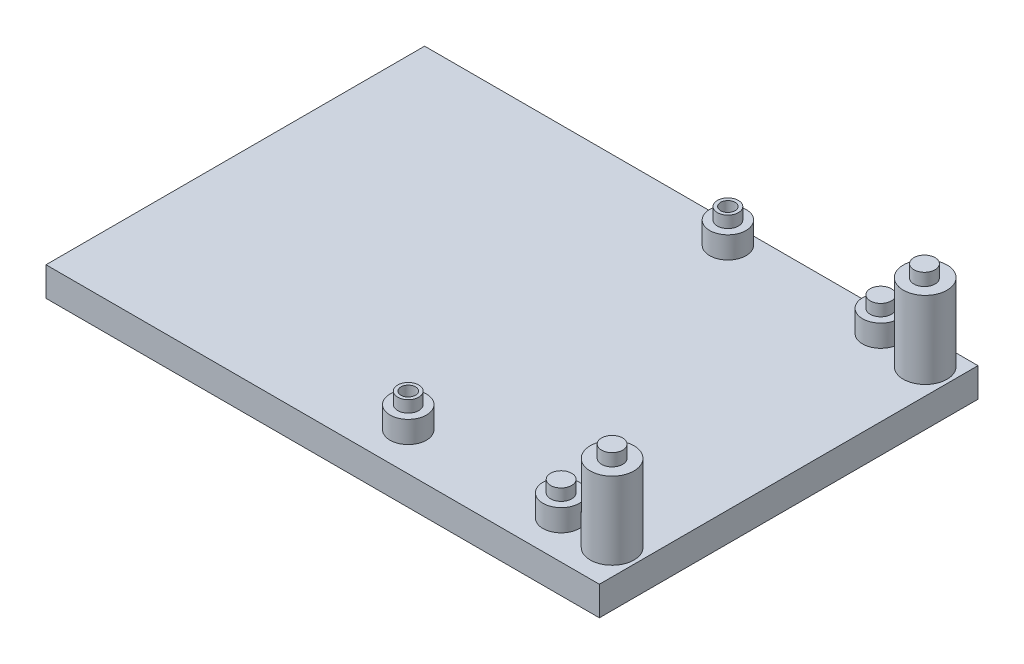
ISO-10303-21;
HEADER;
FILE_DESCRIPTION(('STEP AP214'),'2;1');
FILE_NAME('part.step','',(''),(''),'','','');
FILE_SCHEMA(('AUTOMOTIVE_DESIGN { 1 0 10303 214 1 1 1 1 }'));
ENDSEC;
DATA;
#1=APPLICATION_CONTEXT('core data for automotive mechanical design processes');
#2=APPLICATION_PROTOCOL_DEFINITION('international standard','automotive_design',2000,#1);
#3=PRODUCT_CONTEXT('',#1,'mechanical');
#4=PRODUCT('Part','Part','',(#3));
#5=PRODUCT_RELATED_PRODUCT_CATEGORY('part','',(#4));
#6=PRODUCT_DEFINITION_FORMATION('','',#4);
#7=PRODUCT_DEFINITION_CONTEXT('part definition',#1,'design');
#8=PRODUCT_DEFINITION('design','',#6,#7);
#9=PRODUCT_DEFINITION_SHAPE('','',#8);
#10=(LENGTH_UNIT() NAMED_UNIT(*) SI_UNIT(.MILLI.,.METRE.));
#11=(NAMED_UNIT(*) PLANE_ANGLE_UNIT() SI_UNIT($,.RADIAN.));
#12=(NAMED_UNIT(*) SI_UNIT($,.STERADIAN.) SOLID_ANGLE_UNIT());
#13=UNCERTAINTY_MEASURE_WITH_UNIT(LENGTH_MEASURE(1.E-05),#10,'distance_accuracy_value','');
#14=(GEOMETRIC_REPRESENTATION_CONTEXT(3) GLOBAL_UNCERTAINTY_ASSIGNED_CONTEXT((#13)) GLOBAL_UNIT_ASSIGNED_CONTEXT((#10,
#11,#12)) REPRESENTATION_CONTEXT('',''));
#15=CARTESIAN_POINT('',(0.,0.,0.));
#16=DIRECTION('',(0.,0.,1.));
#17=DIRECTION('',(1.,0.,0.));
#18=AXIS2_PLACEMENT_3D('',#15,#16,#17);
#19=CARTESIAN_POINT('',(42.5,7.,-47.15));
#20=DIRECTION('',(0.,1.,0.));
#21=DIRECTION('',(0.,0.,1.));
#22=AXIS2_PLACEMENT_3D('',#19,#20,#21);
#23=PLANE('',#22);
#24=CARTESIAN_POINT('',(42.5,7.,-47.15));
#25=DIRECTION('',(0.,1.,0.));
#26=DIRECTION('',(0.,0.,1.));
#27=AXIS2_PLACEMENT_3D('',#24,#25,#26);
#28=CIRCLE('',#27,2.5);
#29=CARTESIAN_POINT('',(42.5,7.,-44.65));
#30=VERTEX_POINT('',#29);
#31=EDGE_CURVE('E254',#30,#30,#28,.T.);
#32=ORIENTED_EDGE('',*,*,#31,.T.);
#33=EDGE_LOOP('',(#32));
#34=FACE_BOUND('',#33,.T.);
#35=CARTESIAN_POINT('',(42.5,7.,-47.15));
#36=DIRECTION('',(0.,1.,0.));
#37=DIRECTION('',(0.,0.,1.));
#38=AXIS2_PLACEMENT_3D('',#35,#36,#37);
#39=CIRCLE('',#38,1.45);
#40=CARTESIAN_POINT('',(42.5,7.,-45.7));
#41=VERTEX_POINT('',#40);
#42=EDGE_CURVE('E590',#41,#41,#39,.T.);
#43=ORIENTED_EDGE('',*,*,#42,.F.);
#44=EDGE_LOOP('',(#43));
#45=FACE_BOUND('',#44,.T.);
#46=ADVANCED_FACE('F42',(#34,#45),#23,.T.);
#47=CARTESIAN_POINT('',(42.5,7.,-3.25000000000001));
#48=DIRECTION('',(0.,1.,0.));
#49=DIRECTION('',(0.,0.,1.));
#50=AXIS2_PLACEMENT_3D('',#47,#48,#49);
#51=PLANE('',#50);
#52=CARTESIAN_POINT('',(42.5,7.,-3.25000000000001));
#53=DIRECTION('',(0.,1.,0.));
#54=DIRECTION('',(0.,0.,1.));
#55=AXIS2_PLACEMENT_3D('',#52,#53,#54);
#56=CIRCLE('',#55,2.5);
#57=CARTESIAN_POINT('',(42.5,7.,-0.750000000000005));
#58=VERTEX_POINT('',#57);
#59=EDGE_CURVE('E144',#58,#58,#56,.T.);
#60=ORIENTED_EDGE('',*,*,#59,.T.);
#61=EDGE_LOOP('',(#60));
#62=FACE_BOUND('',#61,.T.);
#63=CARTESIAN_POINT('',(42.5,7.,-3.25000000000001));
#64=DIRECTION('',(0.,1.,0.));
#65=DIRECTION('',(0.,0.,1.));
#66=AXIS2_PLACEMENT_3D('',#63,#64,#65);
#67=CIRCLE('',#66,1.45);
#68=CARTESIAN_POINT('',(42.5,7.,-1.80000000000001));
#69=VERTEX_POINT('',#68);
#70=EDGE_CURVE('E240',#69,#69,#67,.T.);
#71=ORIENTED_EDGE('',*,*,#70,.F.);
#72=EDGE_LOOP('',(#71));
#73=FACE_BOUND('',#72,.T.);
#74=ADVANCED_FACE('F289',(#62,#73),#51,.T.);
#75=CARTESIAN_POINT('',(0.,0.,0.));
#76=DIRECTION('',(0.,-1.,0.));
#77=DIRECTION('',(0.,0.,-1.));
#78=AXIS2_PLACEMENT_3D('',#75,#76,#77);
#79=PLANE('',#78);
#80=DIRECTION('',(0.,0.,-1.));
#81=VECTOR('',#80,1.);
#82=CARTESIAN_POINT('',(74.,0.,1.99999999999999));
#83=LINE('',#82,#81);
#84=CARTESIAN_POINT('',(74.,0.,1.99999999999999));
#85=VERTEX_POINT('',#84);
#86=CARTESIAN_POINT('',(74.,0.,-50.));
#87=VERTEX_POINT('',#86);
#88=EDGE_CURVE('E195',#85,#87,#83,.T.);
#89=ORIENTED_EDGE('',*,*,#88,.F.);
#90=DIRECTION('',(1.,0.,0.));
#91=VECTOR('',#90,1.);
#92=CARTESIAN_POINT('',(-2.00000000000001,0.,1.99999999999999));
#93=LINE('',#92,#91);
#94=CARTESIAN_POINT('',(-2.00000000000001,0.,1.99999999999999));
#95=VERTEX_POINT('',#94);
#96=EDGE_CURVE('E69',#95,#85,#93,.T.);
#97=ORIENTED_EDGE('',*,*,#96,.F.);
#98=DIRECTION('',(0.,0.,1.));
#99=VECTOR('',#98,1.);
#100=CARTESIAN_POINT('',(-2.00000000000001,0.,1.99999999999999));
#101=LINE('',#100,#99);
#102=CARTESIAN_POINT('',(-2.00000000000001,0.,-50.));
#103=VERTEX_POINT('',#102);
#104=EDGE_CURVE('E197',#103,#95,#101,.T.);
#105=ORIENTED_EDGE('',*,*,#104,.F.);
#106=DIRECTION('',(-1.,0.,0.));
#107=VECTOR('',#106,1.);
#108=CARTESIAN_POINT('',(-2.00000000000001,0.,-50.));
#109=LINE('',#108,#107);
#110=EDGE_CURVE('E127',#87,#103,#109,.T.);
#111=ORIENTED_EDGE('',*,*,#110,.F.);
#112=EDGE_LOOP('',(#89,#97,#105,#111));
#113=FACE_BOUND('',#112,.T.);
#114=DIRECTION('',(-1.,0.,0.));
#115=VECTOR('',#114,1.);
#116=CARTESIAN_POINT('',(0.,0.,-44.));
#117=LINE('',#116,#115);
#118=CARTESIAN_POINT('',(72.,0.,-44.));
#119=VERTEX_POINT('',#118);
#120=CARTESIAN_POINT('',(0.,0.,-44.));
#121=VERTEX_POINT('',#120);
#122=EDGE_CURVE('E163',#119,#121,#117,.T.);
#123=ORIENTED_EDGE('',*,*,#122,.T.);
#124=DIRECTION('',(0.,0.,1.));
#125=VECTOR('',#124,1.);
#126=CARTESIAN_POINT('',(0.,0.,0.));
#127=LINE('',#126,#125);
#128=CARTESIAN_POINT('',(0.,0.,0.));
#129=VERTEX_POINT('',#128);
#130=EDGE_CURVE('E61',#121,#129,#127,.T.);
#131=ORIENTED_EDGE('',*,*,#130,.T.);
#132=DIRECTION('',(1.,0.,0.));
#133=VECTOR('',#132,1.);
#134=CARTESIAN_POINT('',(0.,0.,0.));
#135=LINE('',#134,#133);
#136=CARTESIAN_POINT('',(72.,0.,0.));
#137=VERTEX_POINT('',#136);
#138=EDGE_CURVE('E177',#129,#137,#135,.T.);
#139=ORIENTED_EDGE('',*,*,#138,.T.);
#140=DIRECTION('',(0.,0.,-1.));
#141=VECTOR('',#140,1.);
#142=CARTESIAN_POINT('',(72.,0.,0.));
#143=LINE('',#142,#141);
#144=EDGE_CURVE('E181',#137,#119,#143,.T.);
#145=ORIENTED_EDGE('',*,*,#144,.T.);
#146=EDGE_LOOP('',(#123,#131,#139,#145));
#147=FACE_BOUND('',#146,.T.);
#148=ADVANCED_FACE('F295',(#113,#147),#79,.T.);
#149=CARTESIAN_POINT('',(74.,2.,1.99999999999999));
#150=DIRECTION('',(-1.,0.,0.));
#151=DIRECTION('',(0.,0.,1.));
#152=AXIS2_PLACEMENT_3D('',#149,#150,#151);
#153=PLANE('',#152);
#154=ORIENTED_EDGE('',*,*,#88,.T.);
#155=DIRECTION('',(0.,-1.,0.));
#156=VECTOR('',#155,1.);
#157=CARTESIAN_POINT('',(74.,0.,-50.));
#158=LINE('',#157,#156);
#159=CARTESIAN_POINT('',(74.,4.,-50.));
#160=VERTEX_POINT('',#159);
#161=EDGE_CURVE('E138',#160,#87,#158,.T.);
#162=ORIENTED_EDGE('',*,*,#161,.F.);
#163=DIRECTION('',(0.,0.,-1.));
#164=VECTOR('',#163,1.);
#165=CARTESIAN_POINT('',(74.,4.,1.99999999999999));
#166=LINE('',#165,#164);
#167=CARTESIAN_POINT('',(74.,4.,1.99999999999999));
#168=VERTEX_POINT('',#167);
#169=EDGE_CURVE('E133',#168,#160,#166,.T.);
#170=ORIENTED_EDGE('',*,*,#169,.F.);
#171=DIRECTION('',(0.,-1.,0.));
#172=VECTOR('',#171,1.);
#173=CARTESIAN_POINT('',(74.,2.,1.99999999999999));
#174=LINE('',#173,#172);
#175=EDGE_CURVE('E201',#168,#85,#174,.T.);
#176=ORIENTED_EDGE('',*,*,#175,.T.);
#177=EDGE_LOOP('',(#154,#162,#170,#176));
#178=FACE_BOUND('',#177,.T.);
#179=ADVANCED_FACE('F44',(#178),#153,.F.);
#180=CARTESIAN_POINT('',(-2.00000000000001,2.,1.99999999999999));
#181=DIRECTION('',(1.,0.,0.));
#182=DIRECTION('',(0.,0.,-1.));
#183=AXIS2_PLACEMENT_3D('',#180,#181,#182);
#184=PLANE('',#183);
#185=ORIENTED_EDGE('',*,*,#104,.T.);
#186=DIRECTION('',(0.,-1.,0.));
#187=VECTOR('',#186,1.);
#188=CARTESIAN_POINT('',(-2.00000000000001,2.,1.99999999999999));
#189=LINE('',#188,#187);
#190=CARTESIAN_POINT('',(-2.00000000000001,4.,1.99999999999999));
#191=VERTEX_POINT('',#190);
#192=EDGE_CURVE('E121',#191,#95,#189,.T.);
#193=ORIENTED_EDGE('',*,*,#192,.F.);
#194=DIRECTION('',(0.,0.,1.));
#195=VECTOR('',#194,1.);
#196=CARTESIAN_POINT('',(-2.00000000000001,4.,1.99999999999999));
#197=LINE('',#196,#195);
#198=CARTESIAN_POINT('',(-2.00000000000001,4.,-50.));
#199=VERTEX_POINT('',#198);
#200=EDGE_CURVE('E116',#199,#191,#197,.T.);
#201=ORIENTED_EDGE('',*,*,#200,.F.);
#202=DIRECTION('',(0.,1.,0.));
#203=VECTOR('',#202,1.);
#204=CARTESIAN_POINT('',(-2.00000000000001,0.,-50.));
#205=LINE('',#204,#203);
#206=EDGE_CURVE('E120',#103,#199,#205,.T.);
#207=ORIENTED_EDGE('',*,*,#206,.F.);
#208=EDGE_LOOP('',(#185,#193,#201,#207));
#209=FACE_BOUND('',#208,.T.);
#210=ADVANCED_FACE('F118',(#209),#184,.F.);
#211=CARTESIAN_POINT('',(-2.00000000000001,2.,1.99999999999999));
#212=DIRECTION('',(0.,0.,-1.));
#213=DIRECTION('',(-1.,0.,0.));
#214=AXIS2_PLACEMENT_3D('',#211,#212,#213);
#215=PLANE('',#214);
#216=ORIENTED_EDGE('',*,*,#96,.T.);
#217=ORIENTED_EDGE('',*,*,#175,.F.);
#218=DIRECTION('',(1.,0.,0.));
#219=VECTOR('',#218,1.);
#220=CARTESIAN_POINT('',(-2.00000000000001,4.,1.99999999999999));
#221=LINE('',#220,#219);
#222=EDGE_CURVE('E126',#191,#168,#221,.T.);
#223=ORIENTED_EDGE('',*,*,#222,.F.);
#224=ORIENTED_EDGE('',*,*,#192,.T.);
#225=EDGE_LOOP('',(#216,#217,#223,#224));
#226=FACE_BOUND('',#225,.T.);
#227=ADVANCED_FACE('F344',(#226),#215,.F.);
#228=CARTESIAN_POINT('',(0.,2.,0.));
#229=DIRECTION('',(1.,0.,0.));
#230=DIRECTION('',(0.,0.,-1.));
#231=AXIS2_PLACEMENT_3D('',#228,#229,#230);
#232=PLANE('',#231);
#233=ORIENTED_EDGE('',*,*,#130,.F.);
#234=DIRECTION('',(0.,-1.,0.));
#235=VECTOR('',#234,1.);
#236=CARTESIAN_POINT('',(0.,2.,-44.));
#237=LINE('',#236,#235);
#238=CARTESIAN_POINT('',(0.,2.,-44.));
#239=VERTEX_POINT('',#238);
#240=EDGE_CURVE('E174',#239,#121,#237,.T.);
#241=ORIENTED_EDGE('',*,*,#240,.F.);
#242=DIRECTION('',(0.,0.,1.));
#243=VECTOR('',#242,1.);
#244=CARTESIAN_POINT('',(0.,2.,0.));
#245=LINE('',#244,#243);
#246=CARTESIAN_POINT('',(0.,2.,0.));
#247=VERTEX_POINT('',#246);
#248=EDGE_CURVE('E158',#239,#247,#245,.T.);
#249=ORIENTED_EDGE('',*,*,#248,.T.);
#250=DIRECTION('',(0.,-1.,0.));
#251=VECTOR('',#250,1.);
#252=CARTESIAN_POINT('',(0.,2.,0.));
#253=LINE('',#252,#251);
#254=EDGE_CURVE('E193',#247,#129,#253,.T.);
#255=ORIENTED_EDGE('',*,*,#254,.T.);
#256=EDGE_LOOP('',(#233,#241,#249,#255));
#257=FACE_BOUND('',#256,.T.);
#258=ADVANCED_FACE('F340',(#257),#232,.T.);
#259=CARTESIAN_POINT('',(0.,2.,0.));
#260=DIRECTION('',(0.,0.,-1.));
#261=DIRECTION('',(-1.,0.,0.));
#262=AXIS2_PLACEMENT_3D('',#259,#260,#261);
#263=PLANE('',#262);
#264=ORIENTED_EDGE('',*,*,#138,.F.);
#265=ORIENTED_EDGE('',*,*,#254,.F.);
#266=DIRECTION('',(1.,0.,0.));
#267=VECTOR('',#266,1.);
#268=CARTESIAN_POINT('',(0.,2.,0.));
#269=LINE('',#268,#267);
#270=CARTESIAN_POINT('',(72.,2.,0.));
#271=VERTEX_POINT('',#270);
#272=EDGE_CURVE('E162',#247,#271,#269,.T.);
#273=ORIENTED_EDGE('',*,*,#272,.T.);
#274=DIRECTION('',(0.,-1.,0.));
#275=VECTOR('',#274,1.);
#276=CARTESIAN_POINT('',(72.,2.,0.));
#277=LINE('',#276,#275);
#278=EDGE_CURVE('E191',#271,#137,#277,.T.);
#279=ORIENTED_EDGE('',*,*,#278,.T.);
#280=EDGE_LOOP('',(#264,#265,#273,#279));
#281=FACE_BOUND('',#280,.T.);
#282=ADVANCED_FACE('F336',(#281),#263,.T.);
#283=CARTESIAN_POINT('',(72.,2.,0.));
#284=DIRECTION('',(-1.,0.,0.));
#285=DIRECTION('',(0.,0.,1.));
#286=AXIS2_PLACEMENT_3D('',#283,#284,#285);
#287=PLANE('',#286);
#288=ORIENTED_EDGE('',*,*,#144,.F.);
#289=ORIENTED_EDGE('',*,*,#278,.F.);
#290=DIRECTION('',(0.,0.,-1.));
#291=VECTOR('',#290,1.);
#292=CARTESIAN_POINT('',(72.,2.,0.));
#293=LINE('',#292,#291);
#294=CARTESIAN_POINT('',(72.,2.,-44.));
#295=VERTEX_POINT('',#294);
#296=EDGE_CURVE('E167',#271,#295,#293,.T.);
#297=ORIENTED_EDGE('',*,*,#296,.T.);
#298=DIRECTION('',(0.,-1.,0.));
#299=VECTOR('',#298,1.);
#300=CARTESIAN_POINT('',(72.,2.,-44.));
#301=LINE('',#300,#299);
#302=EDGE_CURVE('E189',#295,#119,#301,.T.);
#303=ORIENTED_EDGE('',*,*,#302,.T.);
#304=EDGE_LOOP('',(#288,#289,#297,#303));
#305=FACE_BOUND('',#304,.T.);
#306=ADVANCED_FACE('F332',(#305),#287,.T.);
#307=CARTESIAN_POINT('',(0.,2.,-44.));
#308=DIRECTION('',(0.,0.,1.));
#309=DIRECTION('',(1.,0.,0.));
#310=AXIS2_PLACEMENT_3D('',#307,#308,#309);
#311=PLANE('',#310);
#312=ORIENTED_EDGE('',*,*,#122,.F.);
#313=ORIENTED_EDGE('',*,*,#302,.F.);
#314=DIRECTION('',(-1.,0.,0.));
#315=VECTOR('',#314,1.);
#316=CARTESIAN_POINT('',(0.,2.,-44.));
#317=LINE('',#316,#315);
#318=EDGE_CURVE('E170',#295,#239,#317,.T.);
#319=ORIENTED_EDGE('',*,*,#318,.T.);
#320=ORIENTED_EDGE('',*,*,#240,.T.);
#321=EDGE_LOOP('',(#312,#313,#319,#320));
#322=FACE_BOUND('',#321,.T.);
#323=ADVANCED_FACE('F328',(#322),#311,.T.);
#324=CARTESIAN_POINT('',(0.,2.,0.));
#325=DIRECTION('',(0.,-1.,0.));
#326=DIRECTION('',(0.,0.,-1.));
#327=AXIS2_PLACEMENT_3D('',#324,#325,#326);
#328=PLANE('',#327);
#329=ORIENTED_EDGE('',*,*,#248,.F.);
#330=ORIENTED_EDGE('',*,*,#318,.F.);
#331=ORIENTED_EDGE('',*,*,#296,.F.);
#332=ORIENTED_EDGE('',*,*,#272,.F.);
#333=EDGE_LOOP('',(#329,#330,#331,#332));
#334=FACE_BOUND('',#333,.T.);
#335=ADVANCED_FACE('F323',(#334),#328,.T.);
#336=CARTESIAN_POINT('',(0.,4.,0.));
#337=DIRECTION('',(0.,-1.,0.));
#338=DIRECTION('',(0.,0.,-1.));
#339=AXIS2_PLACEMENT_3D('',#336,#337,#338);
#340=PLANE('',#339);
#341=CARTESIAN_POINT('',(70.5,4.,-46.25));
#342=DIRECTION('',(0.,-1.,0.));
#343=DIRECTION('',(0.,0.,-1.));
#344=AXIS2_PLACEMENT_3D('',#341,#342,#343);
#345=CIRCLE('',#344,3.00000000000001);
#346=CARTESIAN_POINT('',(70.5,4.,-49.25));
#347=VERTEX_POINT('',#346);
#348=EDGE_CURVE('E46',#347,#347,#345,.F.);
#349=ORIENTED_EDGE('',*,*,#348,.F.);
#350=EDGE_LOOP('',(#349));
#351=FACE_BOUND('',#350,.T.);
#352=CARTESIAN_POINT('',(70.5,4.,-3.25000000000001));
#353=DIRECTION('',(0.,-1.,0.));
#354=DIRECTION('',(0.,0.,-1.));
#355=AXIS2_PLACEMENT_3D('',#352,#353,#354);
#356=CIRCLE('',#355,3.00000000000001);
#357=CARTESIAN_POINT('',(70.5,4.,-6.25000000000002));
#358=VERTEX_POINT('',#357);
#359=EDGE_CURVE('E218',#358,#358,#356,.F.);
#360=ORIENTED_EDGE('',*,*,#359,.F.);
#361=EDGE_LOOP('',(#360));
#362=FACE_BOUND('',#361,.T.);
#363=CARTESIAN_POINT('',(63.5,4.,-47.15));
#364=DIRECTION('',(0.,-1.,0.));
#365=DIRECTION('',(0.,0.,-1.));
#366=AXIS2_PLACEMENT_3D('',#363,#364,#365);
#367=CIRCLE('',#366,2.5);
#368=CARTESIAN_POINT('',(63.5,4.,-49.65));
#369=VERTEX_POINT('',#368);
#370=EDGE_CURVE('E214',#369,#369,#367,.F.);
#371=ORIENTED_EDGE('',*,*,#370,.F.);
#372=EDGE_LOOP('',(#371));
#373=FACE_BOUND('',#372,.T.);
#374=CARTESIAN_POINT('',(42.5,4.,-47.15));
#375=DIRECTION('',(0.,-1.,0.));
#376=DIRECTION('',(0.,0.,-1.));
#377=AXIS2_PLACEMENT_3D('',#374,#375,#376);
#378=CIRCLE('',#377,2.5);
#379=CARTESIAN_POINT('',(42.5,4.,-49.65));
#380=VERTEX_POINT('',#379);
#381=EDGE_CURVE('E210',#380,#380,#378,.F.);
#382=ORIENTED_EDGE('',*,*,#381,.F.);
#383=EDGE_LOOP('',(#382));
#384=FACE_BOUND('',#383,.T.);
#385=CARTESIAN_POINT('',(63.5,4.,-3.25000000000001));
#386=DIRECTION('',(0.,-1.,0.));
#387=DIRECTION('',(0.,0.,-1.));
#388=AXIS2_PLACEMENT_3D('',#385,#386,#387);
#389=CIRCLE('',#388,2.5);
#390=CARTESIAN_POINT('',(63.5,4.,-5.75));
#391=VERTEX_POINT('',#390);
#392=EDGE_CURVE('E207',#391,#391,#389,.F.);
#393=ORIENTED_EDGE('',*,*,#392,.F.);
#394=EDGE_LOOP('',(#393));
#395=FACE_BOUND('',#394,.T.);
#396=CARTESIAN_POINT('',(42.5,4.,-3.25000000000001));
#397=DIRECTION('',(0.,-1.,0.));
#398=DIRECTION('',(0.,0.,-1.));
#399=AXIS2_PLACEMENT_3D('',#396,#397,#398);
#400=CIRCLE('',#399,2.5);
#401=CARTESIAN_POINT('',(42.5,4.,-5.75000000000001));
#402=VERTEX_POINT('',#401);
#403=EDGE_CURVE('E204',#402,#402,#400,.F.);
#404=ORIENTED_EDGE('',*,*,#403,.F.);
#405=EDGE_LOOP('',(#404));
#406=FACE_BOUND('',#405,.T.);
#407=ORIENTED_EDGE('',*,*,#200,.T.);
#408=ORIENTED_EDGE('',*,*,#222,.T.);
#409=ORIENTED_EDGE('',*,*,#169,.T.);
#410=DIRECTION('',(1.,0.,0.));
#411=VECTOR('',#410,1.);
#412=CARTESIAN_POINT('',(-2.00000000000001,4.,-50.));
#413=LINE('',#412,#411);
#414=EDGE_CURVE('E130',#199,#160,#413,.T.);
#415=ORIENTED_EDGE('',*,*,#414,.F.);
#416=EDGE_LOOP('',(#407,#408,#409,#415));
#417=FACE_BOUND('',#416,.T.);
#418=ADVANCED_FACE('F131',(#351,#362,#373,#384,#395,#406,#417),#340,.F.);
#419=CARTESIAN_POINT('',(0.,0.,-50.));
#420=DIRECTION('',(0.,0.,-1.));
#421=DIRECTION('',(-1.,0.,0.));
#422=AXIS2_PLACEMENT_3D('',#419,#420,#421);
#423=PLANE('',#422);
#424=ORIENTED_EDGE('',*,*,#206,.T.);
#425=ORIENTED_EDGE('',*,*,#414,.T.);
#426=ORIENTED_EDGE('',*,*,#161,.T.);
#427=ORIENTED_EDGE('',*,*,#110,.T.);
#428=EDGE_LOOP('',(#424,#425,#426,#427));
#429=FACE_BOUND('',#428,.T.);
#430=ADVANCED_FACE('F141',(#429),#423,.T.);
#431=CARTESIAN_POINT('',(42.5,7.,-3.25000000000001));
#432=DIRECTION('',(0.,-1.,0.));
#433=DIRECTION('',(0.,0.,-1.));
#434=AXIS2_PLACEMENT_3D('',#431,#432,#433);
#435=CYLINDRICAL_SURFACE('',#434,2.5);
#436=ORIENTED_EDGE('',*,*,#59,.F.);
#437=EDGE_LOOP('',(#436));
#438=FACE_BOUND('',#437,.T.);
#439=ORIENTED_EDGE('',*,*,#403,.T.);
#440=EDGE_LOOP('',(#439));
#441=FACE_BOUND('',#440,.T.);
#442=ADVANCED_FACE('F313',(#438,#441),#435,.T.);
#443=CARTESIAN_POINT('',(63.5,7.,-3.25000000000001));
#444=DIRECTION('',(0.,-1.,0.));
#445=DIRECTION('',(0.,0.,-1.));
#446=AXIS2_PLACEMENT_3D('',#443,#444,#445);
#447=CYLINDRICAL_SURFACE('',#446,2.5);
#448=CARTESIAN_POINT('',(63.5,7.,-3.25000000000001));
#449=DIRECTION('',(0.,1.,0.));
#450=DIRECTION('',(0.,0.,1.));
#451=AXIS2_PLACEMENT_3D('',#448,#449,#450);
#452=CIRCLE('',#451,2.5);
#453=CARTESIAN_POINT('',(63.5,7.,-0.750000000000012));
#454=VERTEX_POINT('',#453);
#455=EDGE_CURVE('E258',#454,#454,#452,.T.);
#456=ORIENTED_EDGE('',*,*,#455,.F.);
#457=EDGE_LOOP('',(#456));
#458=FACE_BOUND('',#457,.T.);
#459=ORIENTED_EDGE('',*,*,#392,.T.);
#460=EDGE_LOOP('',(#459));
#461=FACE_BOUND('',#460,.T.);
#462=ADVANCED_FACE('F310',(#458,#461),#447,.T.);
#463=CARTESIAN_POINT('',(63.5,7.,-3.25000000000001));
#464=DIRECTION('',(0.,1.,0.));
#465=DIRECTION('',(0.,0.,1.));
#466=AXIS2_PLACEMENT_3D('',#463,#464,#465);
#467=PLANE('',#466);
#468=CARTESIAN_POINT('',(63.5,7.,-3.25000000000001));
#469=DIRECTION('',(0.,1.,0.));
#470=DIRECTION('',(0.,0.,1.));
#471=AXIS2_PLACEMENT_3D('',#468,#469,#470);
#472=CIRCLE('',#471,1.45);
#473=CARTESIAN_POINT('',(63.5,7.,-1.80000000000001));
#474=VERTEX_POINT('',#473);
#475=EDGE_CURVE('E217',#474,#474,#472,.T.);
#476=ORIENTED_EDGE('',*,*,#475,.F.);
#477=EDGE_LOOP('',(#476));
#478=FACE_BOUND('',#477,.T.);
#479=ORIENTED_EDGE('',*,*,#455,.T.);
#480=EDGE_LOOP('',(#479));
#481=FACE_BOUND('',#480,.T.);
#482=ADVANCED_FACE('F306',(#478,#481),#467,.T.);
#483=CARTESIAN_POINT('',(42.5,7.,-47.15));
#484=DIRECTION('',(0.,-1.,0.));
#485=DIRECTION('',(0.,0.,-1.));
#486=AXIS2_PLACEMENT_3D('',#483,#484,#485);
#487=CYLINDRICAL_SURFACE('',#486,2.5);
#488=ORIENTED_EDGE('',*,*,#31,.F.);
#489=EDGE_LOOP('',(#488));
#490=FACE_BOUND('',#489,.T.);
#491=ORIENTED_EDGE('',*,*,#381,.T.);
#492=EDGE_LOOP('',(#491));
#493=FACE_BOUND('',#492,.T.);
#494=ADVANCED_FACE('F303',(#490,#493),#487,.T.);
#495=CARTESIAN_POINT('',(63.5,7.,-47.15));
#496=DIRECTION('',(0.,-1.,0.));
#497=DIRECTION('',(0.,0.,-1.));
#498=AXIS2_PLACEMENT_3D('',#495,#496,#497);
#499=CYLINDRICAL_SURFACE('',#498,2.5);
#500=CARTESIAN_POINT('',(63.5,7.,-47.15));
#501=DIRECTION('',(0.,1.,0.));
#502=DIRECTION('',(0.,0.,1.));
#503=AXIS2_PLACEMENT_3D('',#500,#501,#502);
#504=CIRCLE('',#503,2.5);
#505=CARTESIAN_POINT('',(63.5,7.,-44.65));
#506=VERTEX_POINT('',#505);
#507=EDGE_CURVE('E244',#506,#506,#504,.T.);
#508=ORIENTED_EDGE('',*,*,#507,.F.);
#509=EDGE_LOOP('',(#508));
#510=FACE_BOUND('',#509,.T.);
#511=ORIENTED_EDGE('',*,*,#370,.T.);
#512=EDGE_LOOP('',(#511));
#513=FACE_BOUND('',#512,.T.);
#514=ADVANCED_FACE('F284',(#510,#513),#499,.T.);
#515=CARTESIAN_POINT('',(63.5,7.,-47.15));
#516=DIRECTION('',(0.,1.,0.));
#517=DIRECTION('',(0.,0.,1.));
#518=AXIS2_PLACEMENT_3D('',#515,#516,#517);
#519=PLANE('',#518);
#520=CARTESIAN_POINT('',(63.5,7.,-47.15));
#521=DIRECTION('',(0.,1.,0.));
#522=DIRECTION('',(0.,0.,1.));
#523=AXIS2_PLACEMENT_3D('',#520,#521,#522);
#524=CIRCLE('',#523,1.45);
#525=CARTESIAN_POINT('',(63.5,7.,-45.7));
#526=VERTEX_POINT('',#525);
#527=EDGE_CURVE('E220',#526,#526,#524,.T.);
#528=ORIENTED_EDGE('',*,*,#527,.F.);
#529=EDGE_LOOP('',(#528));
#530=FACE_BOUND('',#529,.T.);
#531=ORIENTED_EDGE('',*,*,#507,.T.);
#532=EDGE_LOOP('',(#531));
#533=FACE_BOUND('',#532,.T.);
#534=ADVANCED_FACE('F275',(#530,#533),#519,.T.);
#535=CARTESIAN_POINT('',(42.5,8.6,-3.25000000000001));
#536=DIRECTION('',(0.,1.,0.));
#537=DIRECTION('',(0.,0.,1.));
#538=AXIS2_PLACEMENT_3D('',#535,#536,#537);
#539=PLANE('',#538);
#540=CARTESIAN_POINT('',(42.5,8.6,-3.25000000000001));
#541=DIRECTION('',(0.,1.,0.));
#542=DIRECTION('',(0.,0.,1.));
#543=AXIS2_PLACEMENT_3D('',#540,#541,#542);
#544=CIRCLE('',#543,1.45);
#545=CARTESIAN_POINT('',(42.5,8.6,-1.80000000000001));
#546=VERTEX_POINT('',#545);
#547=EDGE_CURVE('E241',#546,#546,#544,.T.);
#548=ORIENTED_EDGE('',*,*,#547,.T.);
#549=EDGE_LOOP('',(#548));
#550=FACE_BOUND('',#549,.T.);
#551=CARTESIAN_POINT('',(42.5,8.6,-3.25000000000001));
#552=DIRECTION('',(0.,1.,0.));
#553=DIRECTION('',(0.,0.,1.));
#554=AXIS2_PLACEMENT_3D('',#551,#552,#553);
#555=CIRCLE('',#554,0.999999999999998);
#556=CARTESIAN_POINT('',(42.5,8.6,-2.25000000000001));
#557=VERTEX_POINT('',#556);
#558=EDGE_CURVE('E236',#557,#557,#555,.T.);
#559=ORIENTED_EDGE('',*,*,#558,.F.);
#560=EDGE_LOOP('',(#559));
#561=FACE_BOUND('',#560,.T.);
#562=ADVANCED_FACE('F272',(#550,#561),#539,.T.);
#563=CARTESIAN_POINT('',(42.5,8.6,-3.25000000000001));
#564=DIRECTION('',(0.,-1.,0.));
#565=DIRECTION('',(0.,0.,-1.));
#566=AXIS2_PLACEMENT_3D('',#563,#564,#565);
#567=CYLINDRICAL_SURFACE('',#566,1.45);
#568=ORIENTED_EDGE('',*,*,#547,.F.);
#569=EDGE_LOOP('',(#568));
#570=FACE_BOUND('',#569,.T.);
#571=ORIENTED_EDGE('',*,*,#70,.T.);
#572=EDGE_LOOP('',(#571));
#573=FACE_BOUND('',#572,.T.);
#574=ADVANCED_FACE('F274',(#570,#573),#567,.T.);
#575=CARTESIAN_POINT('',(42.5,4.,-3.25000000000001));
#576=DIRECTION('',(0.,1.,0.));
#577=DIRECTION('',(0.,0.,1.));
#578=AXIS2_PLACEMENT_3D('',#575,#576,#577);
#579=CIRCLE('',#578,0.999999999999998);
#580=CARTESIAN_POINT('',(42.5,4.,-2.25000000000001));
#581=VERTEX_POINT('',#580);
#582=EDGE_CURVE('E148',#581,#581,#579,.T.);
#583=ORIENTED_EDGE('',*,*,#582,.T.);
#584=EDGE_LOOP('',(#583));
#585=FACE_BOUND('',#584,.T.);
#586=ADVANCED_FACE('F263',(#585),#340,.F.);
#587=CARTESIAN_POINT('',(42.5,7.,-3.25000000000001));
#588=DIRECTION('',(0.,-1.,0.));
#589=DIRECTION('',(0.,0.,-1.));
#590=AXIS2_PLACEMENT_3D('',#587,#588,#589);
#591=CYLINDRICAL_SURFACE('',#590,0.999999999999998);
#592=ORIENTED_EDGE('',*,*,#582,.F.);
#593=EDGE_LOOP('',(#592));
#594=FACE_BOUND('',#593,.T.);
#595=ORIENTED_EDGE('',*,*,#558,.T.);
#596=EDGE_LOOP('',(#595));
#597=FACE_BOUND('',#596,.T.);
#598=ADVANCED_FACE('F265',(#594,#597),#591,.F.);
#599=CARTESIAN_POINT('',(63.5,8.6,-3.25000000000001));
#600=DIRECTION('',(0.,-1.,0.));
#601=DIRECTION('',(0.,0.,-1.));
#602=AXIS2_PLACEMENT_3D('',#599,#600,#601);
#603=CYLINDRICAL_SURFACE('',#602,1.45);
#604=CARTESIAN_POINT('',(63.5,8.6,-3.25000000000001));
#605=DIRECTION('',(0.,1.,0.));
#606=DIRECTION('',(0.,0.,1.));
#607=AXIS2_PLACEMENT_3D('',#604,#605,#606);
#608=CIRCLE('',#607,1.45);
#609=CARTESIAN_POINT('',(63.5,8.6,-1.80000000000001));
#610=VERTEX_POINT('',#609);
#611=EDGE_CURVE('E234',#610,#610,#608,.T.);
#612=ORIENTED_EDGE('',*,*,#611,.F.);
#613=EDGE_LOOP('',(#612));
#614=FACE_BOUND('',#613,.T.);
#615=ORIENTED_EDGE('',*,*,#475,.T.);
#616=EDGE_LOOP('',(#615));
#617=FACE_BOUND('',#616,.T.);
#618=ADVANCED_FACE('F268',(#614,#617),#603,.T.);
#619=CARTESIAN_POINT('',(63.5,8.6,-3.25000000000001));
#620=DIRECTION('',(0.,1.,0.));
#621=DIRECTION('',(0.,0.,1.));
#622=AXIS2_PLACEMENT_3D('',#619,#620,#621);
#623=PLANE('',#622);
#624=ORIENTED_EDGE('',*,*,#611,.T.);
#625=EDGE_LOOP('',(#624));
#626=FACE_BOUND('',#625,.T.);
#627=ADVANCED_FACE('F418',(#626),#623,.T.);
#628=CARTESIAN_POINT('',(63.5,8.6,-47.15));
#629=DIRECTION('',(0.,-1.,0.));
#630=DIRECTION('',(0.,0.,-1.));
#631=AXIS2_PLACEMENT_3D('',#628,#629,#630);
#632=CYLINDRICAL_SURFACE('',#631,1.45);
#633=CARTESIAN_POINT('',(63.5,8.6,-47.15));
#634=DIRECTION('',(0.,1.,0.));
#635=DIRECTION('',(0.,0.,1.));
#636=AXIS2_PLACEMENT_3D('',#633,#634,#635);
#637=CIRCLE('',#636,1.45);
#638=CARTESIAN_POINT('',(63.5,8.6,-45.7));
#639=VERTEX_POINT('',#638);
#640=EDGE_CURVE('E232',#639,#639,#637,.T.);
#641=ORIENTED_EDGE('',*,*,#640,.F.);
#642=EDGE_LOOP('',(#641));
#643=FACE_BOUND('',#642,.T.);
#644=ORIENTED_EDGE('',*,*,#527,.T.);
#645=EDGE_LOOP('',(#644));
#646=FACE_BOUND('',#645,.T.);
#647=ADVANCED_FACE('F427',(#643,#646),#632,.T.);
#648=CARTESIAN_POINT('',(63.5,8.6,-47.15));
#649=DIRECTION('',(0.,1.,0.));
#650=DIRECTION('',(0.,0.,1.));
#651=AXIS2_PLACEMENT_3D('',#648,#649,#650);
#652=PLANE('',#651);
#653=ORIENTED_EDGE('',*,*,#640,.T.);
#654=EDGE_LOOP('',(#653));
#655=FACE_BOUND('',#654,.T.);
#656=ADVANCED_FACE('F437',(#655),#652,.T.);
#657=CARTESIAN_POINT('',(42.5,8.6,-47.15));
#658=DIRECTION('',(0.,1.,0.));
#659=DIRECTION('',(0.,0.,1.));
#660=AXIS2_PLACEMENT_3D('',#657,#658,#659);
#661=PLANE('',#660);
#662=CARTESIAN_POINT('',(42.5,8.6,-47.15));
#663=DIRECTION('',(0.,1.,0.));
#664=DIRECTION('',(0.,0.,1.));
#665=AXIS2_PLACEMENT_3D('',#662,#663,#664);
#666=CIRCLE('',#665,1.45);
#667=CARTESIAN_POINT('',(42.5,8.6,-45.7));
#668=VERTEX_POINT('',#667);
#669=EDGE_CURVE('E591',#668,#668,#666,.T.);
#670=ORIENTED_EDGE('',*,*,#669,.T.);
#671=EDGE_LOOP('',(#670));
#672=FACE_BOUND('',#671,.T.);
#673=CARTESIAN_POINT('',(42.5,8.6,-47.15));
#674=DIRECTION('',(0.,1.,0.));
#675=DIRECTION('',(0.,0.,1.));
#676=AXIS2_PLACEMENT_3D('',#673,#674,#675);
#677=CIRCLE('',#676,0.999999999999998);
#678=CARTESIAN_POINT('',(42.5,8.6,-46.15));
#679=VERTEX_POINT('',#678);
#680=EDGE_CURVE('E586',#679,#679,#677,.T.);
#681=ORIENTED_EDGE('',*,*,#680,.F.);
#682=EDGE_LOOP('',(#681));
#683=FACE_BOUND('',#682,.T.);
#684=ADVANCED_FACE('F447',(#672,#683),#661,.T.);
#685=CARTESIAN_POINT('',(42.5,8.6,-47.15));
#686=DIRECTION('',(0.,-1.,0.));
#687=DIRECTION('',(0.,0.,-1.));
#688=AXIS2_PLACEMENT_3D('',#685,#686,#687);
#689=CYLINDRICAL_SURFACE('',#688,1.45);
#690=ORIENTED_EDGE('',*,*,#669,.F.);
#691=EDGE_LOOP('',(#690));
#692=FACE_BOUND('',#691,.T.);
#693=ORIENTED_EDGE('',*,*,#42,.T.);
#694=EDGE_LOOP('',(#693));
#695=FACE_BOUND('',#694,.T.);
#696=ADVANCED_FACE('F457',(#692,#695),#689,.T.);
#697=CARTESIAN_POINT('',(42.5,4.,-47.15));
#698=DIRECTION('',(0.,1.,0.));
#699=DIRECTION('',(0.,0.,1.));
#700=AXIS2_PLACEMENT_3D('',#697,#698,#699);
#701=CIRCLE('',#700,0.999999999999998);
#702=CARTESIAN_POINT('',(42.5,4.,-46.15));
#703=VERTEX_POINT('',#702);
#704=EDGE_CURVE('E250',#703,#703,#701,.T.);
#705=ORIENTED_EDGE('',*,*,#704,.T.);
#706=EDGE_LOOP('',(#705));
#707=FACE_BOUND('',#706,.T.);
#708=ADVANCED_FACE('F325',(#707),#340,.F.);
#709=CARTESIAN_POINT('',(42.5,7.,-47.15));
#710=DIRECTION('',(0.,-1.,0.));
#711=DIRECTION('',(0.,0.,-1.));
#712=AXIS2_PLACEMENT_3D('',#709,#710,#711);
#713=CYLINDRICAL_SURFACE('',#712,0.999999999999998);
#714=ORIENTED_EDGE('',*,*,#704,.F.);
#715=EDGE_LOOP('',(#714));
#716=FACE_BOUND('',#715,.T.);
#717=ORIENTED_EDGE('',*,*,#680,.T.);
#718=EDGE_LOOP('',(#717));
#719=FACE_BOUND('',#718,.T.);
#720=ADVANCED_FACE('F301',(#716,#719),#713,.F.);
#721=CARTESIAN_POINT('',(70.5,14.6,-3.25000000000001));
#722=DIRECTION('',(0.,-1.,0.));
#723=DIRECTION('',(0.,0.,-1.));
#724=AXIS2_PLACEMENT_3D('',#721,#722,#723);
#725=CYLINDRICAL_SURFACE('',#724,3.00000000000001);
#726=CARTESIAN_POINT('',(70.5,14.6,-3.25000000000001));
#727=DIRECTION('',(0.,1.,0.));
#728=DIRECTION('',(0.,0.,1.));
#729=AXIS2_PLACEMENT_3D('',#726,#727,#728);
#730=CIRCLE('',#729,3.00000000000001);
#731=CARTESIAN_POINT('',(70.5,14.6,-0.249999999999999));
#732=VERTEX_POINT('',#731);
#733=EDGE_CURVE('E583',#732,#732,#730,.T.);
#734=ORIENTED_EDGE('',*,*,#733,.F.);
#735=EDGE_LOOP('',(#734));
#736=FACE_BOUND('',#735,.T.);
#737=ORIENTED_EDGE('',*,*,#359,.T.);
#738=EDGE_LOOP('',(#737));
#739=FACE_BOUND('',#738,.T.);
#740=ADVANCED_FACE('F477',(#736,#739),#725,.T.);
#741=CARTESIAN_POINT('',(70.5,14.6,-3.25000000000001));
#742=DIRECTION('',(0.,1.,0.));
#743=DIRECTION('',(0.,0.,1.));
#744=AXIS2_PLACEMENT_3D('',#741,#742,#743);
#745=PLANE('',#744);
#746=CARTESIAN_POINT('',(70.5,14.6,-3.25000000000001));
#747=DIRECTION('',(0.,1.,0.));
#748=DIRECTION('',(0.,0.,1.));
#749=AXIS2_PLACEMENT_3D('',#746,#747,#748);
#750=CIRCLE('',#749,1.45);
#751=CARTESIAN_POINT('',(70.5,14.6,-1.80000000000001));
#752=VERTEX_POINT('',#751);
#753=EDGE_CURVE('E51',#752,#752,#750,.T.);
#754=ORIENTED_EDGE('',*,*,#753,.F.);
#755=EDGE_LOOP('',(#754));
#756=FACE_BOUND('',#755,.T.);
#757=ORIENTED_EDGE('',*,*,#733,.T.);
#758=EDGE_LOOP('',(#757));
#759=FACE_BOUND('',#758,.T.);
#760=ADVANCED_FACE('F496',(#756,#759),#745,.T.);
#761=CARTESIAN_POINT('',(70.5,14.6,-46.25));
#762=DIRECTION('',(0.,-1.,0.));
#763=DIRECTION('',(0.,0.,-1.));
#764=AXIS2_PLACEMENT_3D('',#761,#762,#763);
#765=CYLINDRICAL_SURFACE('',#764,3.00000000000001);
#766=CARTESIAN_POINT('',(70.5,14.6,-46.25));
#767=DIRECTION('',(0.,1.,0.));
#768=DIRECTION('',(0.,0.,1.));
#769=AXIS2_PLACEMENT_3D('',#766,#767,#768);
#770=CIRCLE('',#769,3.00000000000001);
#771=CARTESIAN_POINT('',(70.5,14.6,-43.25));
#772=VERTEX_POINT('',#771);
#773=EDGE_CURVE('E576',#772,#772,#770,.T.);
#774=ORIENTED_EDGE('',*,*,#773,.F.);
#775=EDGE_LOOP('',(#774));
#776=FACE_BOUND('',#775,.T.);
#777=ORIENTED_EDGE('',*,*,#348,.T.);
#778=EDGE_LOOP('',(#777));
#779=FACE_BOUND('',#778,.T.);
#780=ADVANCED_FACE('F504',(#776,#779),#765,.T.);
#781=CARTESIAN_POINT('',(70.5,14.6,-46.25));
#782=DIRECTION('',(0.,1.,0.));
#783=DIRECTION('',(0.,0.,1.));
#784=AXIS2_PLACEMENT_3D('',#781,#782,#783);
#785=PLANE('',#784);
#786=CARTESIAN_POINT('',(70.5,14.6,-46.15));
#787=DIRECTION('',(0.,1.,0.));
#788=DIRECTION('',(0.,0.,1.));
#789=AXIS2_PLACEMENT_3D('',#786,#787,#788);
#790=CIRCLE('',#789,1.45);
#791=CARTESIAN_POINT('',(70.5,14.6,-44.7));
#792=VERTEX_POINT('',#791);
#793=EDGE_CURVE('E11',#792,#792,#790,.T.);
#794=ORIENTED_EDGE('',*,*,#793,.F.);
#795=EDGE_LOOP('',(#794));
#796=FACE_BOUND('',#795,.T.);
#797=ORIENTED_EDGE('',*,*,#773,.T.);
#798=EDGE_LOOP('',(#797));
#799=FACE_BOUND('',#798,.T.);
#800=ADVANCED_FACE('F509',(#796,#799),#785,.T.);
#801=CARTESIAN_POINT('',(70.5,16.3,-3.25000000000001));
#802=DIRECTION('',(0.,-1.,0.));
#803=DIRECTION('',(0.,0.,-1.));
#804=AXIS2_PLACEMENT_3D('',#801,#802,#803);
#805=CYLINDRICAL_SURFACE('',#804,1.45);
#806=CARTESIAN_POINT('',(70.5,16.3,-3.25000000000001));
#807=DIRECTION('',(0.,1.,0.));
#808=DIRECTION('',(0.,0.,1.));
#809=AXIS2_PLACEMENT_3D('',#806,#807,#808);
#810=CIRCLE('',#809,1.45);
#811=CARTESIAN_POINT('',(70.5,16.3,-1.80000000000001));
#812=VERTEX_POINT('',#811);
#813=EDGE_CURVE('E573',#812,#812,#810,.T.);
#814=ORIENTED_EDGE('',*,*,#813,.F.);
#815=EDGE_LOOP('',(#814));
#816=FACE_BOUND('',#815,.T.);
#817=ORIENTED_EDGE('',*,*,#753,.T.);
#818=EDGE_LOOP('',(#817));
#819=FACE_BOUND('',#818,.T.);
#820=ADVANCED_FACE('F526',(#816,#819),#805,.T.);
#821=CARTESIAN_POINT('',(70.5,16.3,-3.25000000000001));
#822=DIRECTION('',(0.,1.,0.));
#823=DIRECTION('',(0.,0.,1.));
#824=AXIS2_PLACEMENT_3D('',#821,#822,#823);
#825=PLANE('',#824);
#826=ORIENTED_EDGE('',*,*,#813,.T.);
#827=EDGE_LOOP('',(#826));
#828=FACE_BOUND('',#827,.T.);
#829=ADVANCED_FACE('F536',(#828),#825,.T.);
#830=CARTESIAN_POINT('',(70.5,16.3,-46.15));
#831=DIRECTION('',(0.,-1.,0.));
#832=DIRECTION('',(0.,0.,-1.));
#833=AXIS2_PLACEMENT_3D('',#830,#831,#832);
#834=CYLINDRICAL_SURFACE('',#833,1.45);
#835=CARTESIAN_POINT('',(70.5,16.3,-46.15));
#836=DIRECTION('',(0.,1.,0.));
#837=DIRECTION('',(0.,0.,1.));
#838=AXIS2_PLACEMENT_3D('',#835,#836,#837);
#839=CIRCLE('',#838,1.45);
#840=CARTESIAN_POINT('',(70.5,16.3,-44.7));
#841=VERTEX_POINT('',#840);
#842=EDGE_CURVE('E572',#841,#841,#839,.T.);
#843=ORIENTED_EDGE('',*,*,#842,.F.);
#844=EDGE_LOOP('',(#843));
#845=FACE_BOUND('',#844,.T.);
#846=ORIENTED_EDGE('',*,*,#793,.T.);
#847=EDGE_LOOP('',(#846));
#848=FACE_BOUND('',#847,.T.);
#849=ADVANCED_FACE('F546',(#845,#848),#834,.T.);
#850=CARTESIAN_POINT('',(70.5,16.3,-46.15));
#851=DIRECTION('',(0.,1.,0.));
#852=DIRECTION('',(0.,0.,1.));
#853=AXIS2_PLACEMENT_3D('',#850,#851,#852);
#854=PLANE('',#853);
#855=ORIENTED_EDGE('',*,*,#842,.T.);
#856=EDGE_LOOP('',(#855));
#857=FACE_BOUND('',#856,.T.);
#858=ADVANCED_FACE('F556',(#857),#854,.T.);
#859=CLOSED_SHELL('',(#46,#74,#148,#179,#210,#227,#258,#282,#306,#323,#335,#418,#430,#442,#462,
#482,#494,#514,#534,#562,#574,#586,#598,#618,#627,#647,#656,#684,#696,#708,#720,#740,#760,#780,
#800,#820,#829,#849,#858));
#860=MANIFOLD_SOLID_BREP('B2',#859);
#861=ADVANCED_BREP_SHAPE_REPRESENTATION('',(#18,#860),#14);
#862=SHAPE_DEFINITION_REPRESENTATION(#9,#861);
ENDSEC;
END-ISO-10303-21;
